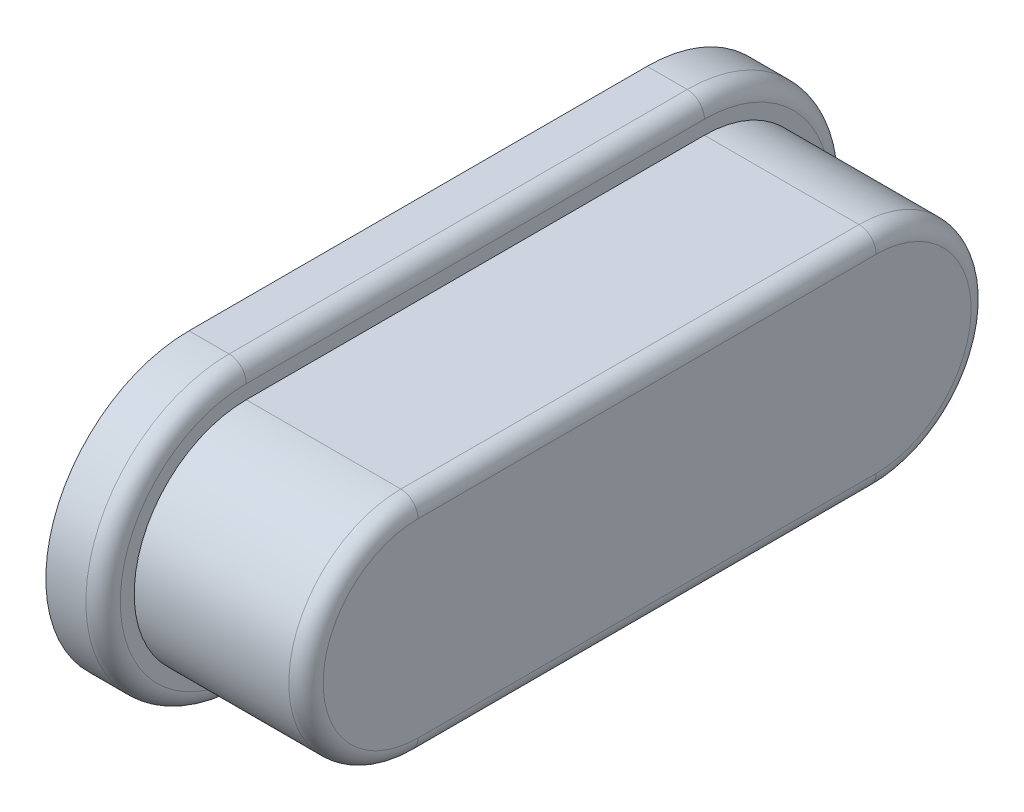
ISO-10303-21;
HEADER;
FILE_DESCRIPTION(('STEP AP214'),'2;1');
FILE_NAME('part.step','',(''),(''),'','','');
FILE_SCHEMA(('AUTOMOTIVE_DESIGN { 1 0 10303 214 1 1 1 1 }'));
ENDSEC;
DATA;
#1=APPLICATION_CONTEXT('core data for automotive mechanical design processes');
#2=APPLICATION_PROTOCOL_DEFINITION('international standard','automotive_design',2000,#1);
#3=PRODUCT_CONTEXT('',#1,'mechanical');
#4=PRODUCT('Part','Part','',(#3));
#5=PRODUCT_RELATED_PRODUCT_CATEGORY('part','',(#4));
#6=PRODUCT_DEFINITION_FORMATION('','',#4);
#7=PRODUCT_DEFINITION_CONTEXT('part definition',#1,'design');
#8=PRODUCT_DEFINITION('design','',#6,#7);
#9=PRODUCT_DEFINITION_SHAPE('','',#8);
#10=(LENGTH_UNIT() NAMED_UNIT(*) SI_UNIT(.MILLI.,.METRE.));
#11=(NAMED_UNIT(*) PLANE_ANGLE_UNIT() SI_UNIT($,.RADIAN.));
#12=(NAMED_UNIT(*) SI_UNIT($,.STERADIAN.) SOLID_ANGLE_UNIT());
#13=UNCERTAINTY_MEASURE_WITH_UNIT(LENGTH_MEASURE(1.E-05),#10,'distance_accuracy_value','');
#14=(GEOMETRIC_REPRESENTATION_CONTEXT(3) GLOBAL_UNCERTAINTY_ASSIGNED_CONTEXT((#13)) GLOBAL_UNIT_ASSIGNED_CONTEXT((#10,
#11,#12)) REPRESENTATION_CONTEXT('',''));
#15=CARTESIAN_POINT('',(0.,0.,0.));
#16=DIRECTION('',(0.,0.,1.));
#17=DIRECTION('',(1.,0.,0.));
#18=AXIS2_PLACEMENT_3D('',#15,#16,#17);
#19=CARTESIAN_POINT('',(1.,0.,0.));
#20=DIRECTION('',(1.,0.,0.));
#21=DIRECTION('',(0.,0.,-1.));
#22=AXIS2_PLACEMENT_3D('',#19,#20,#21);
#23=PLANE('',#22);
#24=CARTESIAN_POINT('',(1.,0.,-8.));
#25=DIRECTION('',(1.,0.,0.));
#26=DIRECTION('',(0.,0.,-1.));
#27=AXIS2_PLACEMENT_3D('',#24,#25,#26);
#28=CIRCLE('',#27,2.2);
#29=CARTESIAN_POINT('',(1.,-2.2,-8.));
#30=VERTEX_POINT('',#29);
#31=CARTESIAN_POINT('',(1.,2.2,-8.));
#32=VERTEX_POINT('',#31);
#33=EDGE_CURVE('E181',#30,#32,#28,.T.);
#34=ORIENTED_EDGE('',*,*,#33,.T.);
#35=DIRECTION('',(0.,0.,1.));
#36=VECTOR('',#35,1.);
#37=CARTESIAN_POINT('',(1.,2.2,0.));
#38=LINE('',#37,#36);
#39=CARTESIAN_POINT('',(1.,2.2,0.));
#40=VERTEX_POINT('',#39);
#41=EDGE_CURVE('E183',#32,#40,#38,.T.);
#42=ORIENTED_EDGE('',*,*,#41,.T.);
#43=CARTESIAN_POINT('',(1.,0.,0.));
#44=DIRECTION('',(1.,0.,0.));
#45=DIRECTION('',(0.,0.,-1.));
#46=AXIS2_PLACEMENT_3D('',#43,#44,#45);
#47=CIRCLE('',#46,2.2);
#48=CARTESIAN_POINT('',(1.,-2.2,0.));
#49=VERTEX_POINT('',#48);
#50=EDGE_CURVE('E179',#40,#49,#47,.T.);
#51=ORIENTED_EDGE('',*,*,#50,.T.);
#52=DIRECTION('',(0.,0.,-1.));
#53=VECTOR('',#52,1.);
#54=CARTESIAN_POINT('',(1.,-2.2,-8.));
#55=LINE('',#54,#53);
#56=EDGE_CURVE('E177',#49,#30,#55,.T.);
#57=ORIENTED_EDGE('',*,*,#56,.T.);
#58=EDGE_LOOP('',(#34,#42,#51,#57));
#59=FACE_BOUND('',#58,.T.);
#60=DIRECTION('',(0.,0.,-1.));
#61=VECTOR('',#60,1.);
#62=CARTESIAN_POINT('',(1.,-1.95713580910831,0.));
#63=LINE('',#62,#61);
#64=CARTESIAN_POINT('',(1.,-1.95713580910831,0.));
#65=VERTEX_POINT('',#64);
#66=CARTESIAN_POINT('',(1.,-1.95713580910831,-8.));
#67=VERTEX_POINT('',#66);
#68=EDGE_CURVE('E129',#65,#67,#63,.T.);
#69=ORIENTED_EDGE('',*,*,#68,.F.);
#70=CARTESIAN_POINT('',(1.,0.,0.));
#71=DIRECTION('',(1.,0.,0.));
#72=DIRECTION('',(0.,0.,-1.));
#73=AXIS2_PLACEMENT_3D('',#70,#71,#72);
#74=CIRCLE('',#73,1.95713580910831);
#75=CARTESIAN_POINT('',(1.,1.95713580910831,0.));
#76=VERTEX_POINT('',#75);
#77=EDGE_CURVE('E139',#76,#65,#74,.T.);
#78=ORIENTED_EDGE('',*,*,#77,.F.);
#79=DIRECTION('',(0.,0.,1.));
#80=VECTOR('',#79,1.);
#81=CARTESIAN_POINT('',(1.,1.95713580910831,0.));
#82=LINE('',#81,#80);
#83=CARTESIAN_POINT('',(1.,1.95713580910831,-8.));
#84=VERTEX_POINT('',#83);
#85=EDGE_CURVE('E150',#84,#76,#82,.T.);
#86=ORIENTED_EDGE('',*,*,#85,.F.);
#87=CARTESIAN_POINT('',(1.,0.,-8.));
#88=DIRECTION('',(1.,0.,0.));
#89=DIRECTION('',(0.,0.,-1.));
#90=AXIS2_PLACEMENT_3D('',#87,#88,#89);
#91=CIRCLE('',#90,1.95713580910831);
#92=EDGE_CURVE('E148',#67,#84,#91,.T.);
#93=ORIENTED_EDGE('',*,*,#92,.F.);
#94=EDGE_LOOP('',(#69,#78,#86,#93));
#95=FACE_BOUND('',#94,.T.);
#96=ADVANCED_FACE('F35',(#59,#95),#23,.T.);
#97=CARTESIAN_POINT('',(1.,0.,0.));
#98=DIRECTION('',(-1.,0.,0.));
#99=DIRECTION('',(0.,0.,1.));
#100=AXIS2_PLACEMENT_3D('',#97,#98,#99);
#101=CYLINDRICAL_SURFACE('',#100,2.5);
#102=DIRECTION('',(-1.,0.,0.));
#103=VECTOR('',#102,1.);
#104=CARTESIAN_POINT('',(1.,-2.5,0.));
#105=LINE('',#104,#103);
#106=CARTESIAN_POINT('',(0.7,-2.5,0.));
#107=VERTEX_POINT('',#106);
#108=CARTESIAN_POINT('',(0.,-2.5,0.));
#109=VERTEX_POINT('',#108);
#110=EDGE_CURVE('E175',#107,#109,#105,.T.);
#111=ORIENTED_EDGE('',*,*,#110,.F.);
#112=CARTESIAN_POINT('',(0.7,0.,0.));
#113=DIRECTION('',(1.,0.,0.));
#114=DIRECTION('',(0.,0.,-1.));
#115=AXIS2_PLACEMENT_3D('',#112,#113,#114);
#116=CIRCLE('',#115,2.5);
#117=CARTESIAN_POINT('',(0.7,2.5,0.));
#118=VERTEX_POINT('',#117);
#119=EDGE_CURVE('E191',#107,#118,#116,.F.);
#120=ORIENTED_EDGE('',*,*,#119,.T.);
#121=DIRECTION('',(-1.,0.,0.));
#122=VECTOR('',#121,1.);
#123=CARTESIAN_POINT('',(1.,2.5,0.));
#124=LINE('',#123,#122);
#125=CARTESIAN_POINT('',(0.,2.5,0.));
#126=VERTEX_POINT('',#125);
#127=EDGE_CURVE('E169',#118,#126,#124,.T.);
#128=ORIENTED_EDGE('',*,*,#127,.T.);
#129=CARTESIAN_POINT('',(0.,0.,0.));
#130=DIRECTION('',(1.,0.,0.));
#131=DIRECTION('',(0.,0.,-1.));
#132=AXIS2_PLACEMENT_3D('',#129,#130,#131);
#133=CIRCLE('',#132,2.5);
#134=EDGE_CURVE('E135',#126,#109,#133,.T.);
#135=ORIENTED_EDGE('',*,*,#134,.T.);
#136=EDGE_LOOP('',(#111,#120,#128,#135));
#137=FACE_BOUND('',#136,.T.);
#138=ADVANCED_FACE('F250',(#137),#101,.T.);
#139=CARTESIAN_POINT('',(1.,-2.5,0.));
#140=DIRECTION('',(0.,1.,0.));
#141=DIRECTION('',(0.,0.,1.));
#142=AXIS2_PLACEMENT_3D('',#139,#140,#141);
#143=PLANE('',#142);
#144=DIRECTION('',(-1.,0.,0.));
#145=VECTOR('',#144,1.);
#146=CARTESIAN_POINT('',(1.,-2.5,-8.));
#147=LINE('',#146,#145);
#148=CARTESIAN_POINT('',(0.7,-2.5,-8.));
#149=VERTEX_POINT('',#148);
#150=CARTESIAN_POINT('',(0.,-2.5,-8.));
#151=VERTEX_POINT('',#150);
#152=EDGE_CURVE('E173',#149,#151,#147,.T.);
#153=ORIENTED_EDGE('',*,*,#152,.F.);
#154=DIRECTION('',(0.,0.,-1.));
#155=VECTOR('',#154,1.);
#156=CARTESIAN_POINT('',(0.7,-2.5,0.));
#157=LINE('',#156,#155);
#158=EDGE_CURVE('E193',#149,#107,#157,.F.);
#159=ORIENTED_EDGE('',*,*,#158,.T.);
#160=ORIENTED_EDGE('',*,*,#110,.T.);
#161=DIRECTION('',(0.,0.,-1.));
#162=VECTOR('',#161,1.);
#163=CARTESIAN_POINT('',(0.,-2.5,0.));
#164=LINE('',#163,#162);
#165=EDGE_CURVE('E160',#109,#151,#164,.T.);
#166=ORIENTED_EDGE('',*,*,#165,.T.);
#167=EDGE_LOOP('',(#153,#159,#160,#166));
#168=FACE_BOUND('',#167,.T.);
#169=ADVANCED_FACE('F256',(#168),#143,.F.);
#170=CARTESIAN_POINT('',(1.,0.,-8.));
#171=DIRECTION('',(-1.,0.,0.));
#172=DIRECTION('',(0.,0.,1.));
#173=AXIS2_PLACEMENT_3D('',#170,#171,#172);
#174=CYLINDRICAL_SURFACE('',#173,2.5);
#175=DIRECTION('',(-1.,0.,0.));
#176=VECTOR('',#175,1.);
#177=CARTESIAN_POINT('',(1.,2.5,-8.));
#178=LINE('',#177,#176);
#179=CARTESIAN_POINT('',(0.7,2.5,-8.));
#180=VERTEX_POINT('',#179);
#181=CARTESIAN_POINT('',(0.,2.5,-8.));
#182=VERTEX_POINT('',#181);
#183=EDGE_CURVE('E171',#180,#182,#178,.T.);
#184=ORIENTED_EDGE('',*,*,#183,.F.);
#185=CARTESIAN_POINT('',(0.7,0.,-8.));
#186=DIRECTION('',(1.,0.,0.));
#187=DIRECTION('',(0.,0.,-1.));
#188=AXIS2_PLACEMENT_3D('',#185,#186,#187);
#189=CIRCLE('',#188,2.5);
#190=EDGE_CURVE('E189',#180,#149,#189,.F.);
#191=ORIENTED_EDGE('',*,*,#190,.T.);
#192=ORIENTED_EDGE('',*,*,#152,.T.);
#193=CARTESIAN_POINT('',(0.,0.,-8.));
#194=DIRECTION('',(1.,0.,0.));
#195=DIRECTION('',(0.,0.,-1.));
#196=AXIS2_PLACEMENT_3D('',#193,#194,#195);
#197=CIRCLE('',#196,2.5);
#198=EDGE_CURVE('E163',#151,#182,#197,.T.);
#199=ORIENTED_EDGE('',*,*,#198,.T.);
#200=EDGE_LOOP('',(#184,#191,#192,#199));
#201=FACE_BOUND('',#200,.T.);
#202=ADVANCED_FACE('F268',(#201),#174,.T.);
#203=CARTESIAN_POINT('',(1.,2.5,0.));
#204=DIRECTION('',(0.,-1.,0.));
#205=DIRECTION('',(0.,0.,-1.));
#206=AXIS2_PLACEMENT_3D('',#203,#204,#205);
#207=PLANE('',#206);
#208=ORIENTED_EDGE('',*,*,#127,.F.);
#209=DIRECTION('',(0.,0.,1.));
#210=VECTOR('',#209,1.);
#211=CARTESIAN_POINT('',(0.7,2.5,-8.));
#212=LINE('',#211,#210);
#213=EDGE_CURVE('E186',#118,#180,#212,.F.);
#214=ORIENTED_EDGE('',*,*,#213,.T.);
#215=ORIENTED_EDGE('',*,*,#183,.T.);
#216=DIRECTION('',(0.,0.,1.));
#217=VECTOR('',#216,1.);
#218=CARTESIAN_POINT('',(0.,2.5,0.));
#219=LINE('',#218,#217);
#220=EDGE_CURVE('E166',#182,#126,#219,.T.);
#221=ORIENTED_EDGE('',*,*,#220,.T.);
#222=EDGE_LOOP('',(#208,#214,#215,#221));
#223=FACE_BOUND('',#222,.T.);
#224=ADVANCED_FACE('F264',(#223),#207,.F.);
#225=CARTESIAN_POINT('',(0.,0.,0.));
#226=DIRECTION('',(1.,0.,0.));
#227=DIRECTION('',(0.,0.,-1.));
#228=AXIS2_PLACEMENT_3D('',#225,#226,#227);
#229=PLANE('',#228);
#230=ORIENTED_EDGE('',*,*,#134,.F.);
#231=ORIENTED_EDGE('',*,*,#220,.F.);
#232=ORIENTED_EDGE('',*,*,#198,.F.);
#233=ORIENTED_EDGE('',*,*,#165,.F.);
#234=EDGE_LOOP('',(#230,#231,#232,#233));
#235=FACE_BOUND('',#234,.T.);
#236=ADVANCED_FACE('F261',(#235),#229,.F.);
#237=CARTESIAN_POINT('',(4.,0.,0.));
#238=DIRECTION('',(-1.,0.,0.));
#239=DIRECTION('',(0.,0.,1.));
#240=AXIS2_PLACEMENT_3D('',#237,#238,#239);
#241=CYLINDRICAL_SURFACE('',#240,1.95713580910831);
#242=DIRECTION('',(-1.,0.,0.));
#243=VECTOR('',#242,1.);
#244=CARTESIAN_POINT('',(4.,-1.95713580910831,0.));
#245=LINE('',#244,#243);
#246=CARTESIAN_POINT('',(3.7,-1.95713580910831,0.));
#247=VERTEX_POINT('',#246);
#248=EDGE_CURVE('E125',#247,#65,#245,.T.);
#249=ORIENTED_EDGE('',*,*,#248,.F.);
#250=CARTESIAN_POINT('',(3.7,0.,0.));
#251=DIRECTION('',(1.,0.,0.));
#252=DIRECTION('',(0.,0.,-1.));
#253=AXIS2_PLACEMENT_3D('',#250,#251,#252);
#254=CIRCLE('',#253,1.95713580910831);
#255=CARTESIAN_POINT('',(3.7,1.95713580910831,0.));
#256=VERTEX_POINT('',#255);
#257=EDGE_CURVE('E204',#247,#256,#254,.F.);
#258=ORIENTED_EDGE('',*,*,#257,.T.);
#259=DIRECTION('',(-1.,0.,0.));
#260=VECTOR('',#259,1.);
#261=CARTESIAN_POINT('',(4.,1.95713580910831,0.));
#262=LINE('',#261,#260);
#263=EDGE_CURVE('E141',#256,#76,#262,.T.);
#264=ORIENTED_EDGE('',*,*,#263,.T.);
#265=ORIENTED_EDGE('',*,*,#77,.T.);
#266=EDGE_LOOP('',(#249,#258,#264,#265));
#267=FACE_BOUND('',#266,.T.);
#268=ADVANCED_FACE('F140',(#267),#241,.T.);
#269=CARTESIAN_POINT('',(4.,-1.95713580910831,0.));
#270=DIRECTION('',(0.,1.,0.));
#271=DIRECTION('',(0.,0.,1.));
#272=AXIS2_PLACEMENT_3D('',#269,#270,#271);
#273=PLANE('',#272);
#274=DIRECTION('',(-1.,0.,0.));
#275=VECTOR('',#274,1.);
#276=CARTESIAN_POINT('',(4.,-1.95713580910831,-8.));
#277=LINE('',#276,#275);
#278=CARTESIAN_POINT('',(3.7,-1.95713580910831,-8.));
#279=VERTEX_POINT('',#278);
#280=EDGE_CURVE('E136',#279,#67,#277,.T.);
#281=ORIENTED_EDGE('',*,*,#280,.F.);
#282=DIRECTION('',(0.,0.,-1.));
#283=VECTOR('',#282,1.);
#284=CARTESIAN_POINT('',(3.7,-1.95713580910831,0.));
#285=LINE('',#284,#283);
#286=EDGE_CURVE('E11',#279,#247,#285,.F.);
#287=ORIENTED_EDGE('',*,*,#286,.T.);
#288=ORIENTED_EDGE('',*,*,#248,.T.);
#289=ORIENTED_EDGE('',*,*,#68,.T.);
#290=EDGE_LOOP('',(#281,#287,#288,#289));
#291=FACE_BOUND('',#290,.T.);
#292=ADVANCED_FACE('F127',(#291),#273,.F.);
#293=CARTESIAN_POINT('',(4.,0.,-8.));
#294=DIRECTION('',(-1.,0.,0.));
#295=DIRECTION('',(0.,0.,1.));
#296=AXIS2_PLACEMENT_3D('',#293,#294,#295);
#297=CYLINDRICAL_SURFACE('',#296,1.95713580910831);
#298=DIRECTION('',(-1.,0.,0.));
#299=VECTOR('',#298,1.);
#300=CARTESIAN_POINT('',(4.,1.95713580910831,-8.));
#301=LINE('',#300,#299);
#302=CARTESIAN_POINT('',(3.7,1.95713580910831,-8.));
#303=VERTEX_POINT('',#302);
#304=EDGE_CURVE('E155',#303,#84,#301,.T.);
#305=ORIENTED_EDGE('',*,*,#304,.F.);
#306=CARTESIAN_POINT('',(3.7,0.,-8.));
#307=DIRECTION('',(1.,0.,0.));
#308=DIRECTION('',(0.,0.,-1.));
#309=AXIS2_PLACEMENT_3D('',#306,#307,#308);
#310=CIRCLE('',#309,1.95713580910831);
#311=EDGE_CURVE('E44',#303,#279,#310,.F.);
#312=ORIENTED_EDGE('',*,*,#311,.T.);
#313=ORIENTED_EDGE('',*,*,#280,.T.);
#314=ORIENTED_EDGE('',*,*,#92,.T.);
#315=EDGE_LOOP('',(#305,#312,#313,#314));
#316=FACE_BOUND('',#315,.T.);
#317=ADVANCED_FACE('F239',(#316),#297,.T.);
#318=CARTESIAN_POINT('',(4.,1.95713580910831,0.));
#319=DIRECTION('',(0.,-1.,0.));
#320=DIRECTION('',(0.,0.,-1.));
#321=AXIS2_PLACEMENT_3D('',#318,#319,#320);
#322=PLANE('',#321);
#323=ORIENTED_EDGE('',*,*,#263,.F.);
#324=DIRECTION('',(0.,0.,1.));
#325=VECTOR('',#324,1.);
#326=CARTESIAN_POINT('',(3.7,1.95713580910831,-8.));
#327=LINE('',#326,#325);
#328=EDGE_CURVE('E59',#256,#303,#327,.F.);
#329=ORIENTED_EDGE('',*,*,#328,.T.);
#330=ORIENTED_EDGE('',*,*,#304,.T.);
#331=ORIENTED_EDGE('',*,*,#85,.T.);
#332=EDGE_LOOP('',(#323,#329,#330,#331));
#333=FACE_BOUND('',#332,.T.);
#334=ADVANCED_FACE('F238',(#333),#322,.F.);
#335=CARTESIAN_POINT('',(4.,0.,0.));
#336=DIRECTION('',(1.,0.,0.));
#337=DIRECTION('',(0.,0.,-1.));
#338=AXIS2_PLACEMENT_3D('',#335,#336,#337);
#339=PLANE('',#338);
#340=DIRECTION('',(0.,0.,1.));
#341=VECTOR('',#340,1.);
#342=CARTESIAN_POINT('',(4.,1.65713580910831,0.));
#343=LINE('',#342,#341);
#344=CARTESIAN_POINT('',(4.,1.65713580910831,-8.));
#345=VERTEX_POINT('',#344);
#346=CARTESIAN_POINT('',(4.,1.65713580910831,0.));
#347=VERTEX_POINT('',#346);
#348=EDGE_CURVE('E199',#345,#347,#343,.T.);
#349=ORIENTED_EDGE('',*,*,#348,.T.);
#350=CARTESIAN_POINT('',(4.,0.,0.));
#351=DIRECTION('',(1.,0.,0.));
#352=DIRECTION('',(0.,0.,-1.));
#353=AXIS2_PLACEMENT_3D('',#350,#351,#352);
#354=CIRCLE('',#353,1.65713580910831);
#355=CARTESIAN_POINT('',(4.,-1.65713580910831,0.));
#356=VERTEX_POINT('',#355);
#357=EDGE_CURVE('E201',#347,#356,#354,.T.);
#358=ORIENTED_EDGE('',*,*,#357,.T.);
#359=DIRECTION('',(0.,0.,-1.));
#360=VECTOR('',#359,1.);
#361=CARTESIAN_POINT('',(4.,-1.65713580910831,-8.));
#362=LINE('',#361,#360);
#363=CARTESIAN_POINT('',(4.,-1.65713580910831,-8.));
#364=VERTEX_POINT('',#363);
#365=EDGE_CURVE('E195',#356,#364,#362,.T.);
#366=ORIENTED_EDGE('',*,*,#365,.T.);
#367=CARTESIAN_POINT('',(4.,0.,-8.));
#368=DIRECTION('',(1.,0.,0.));
#369=DIRECTION('',(0.,0.,-1.));
#370=AXIS2_PLACEMENT_3D('',#367,#368,#369);
#371=CIRCLE('',#370,1.65713580910831);
#372=EDGE_CURVE('E197',#364,#345,#371,.T.);
#373=ORIENTED_EDGE('',*,*,#372,.T.);
#374=EDGE_LOOP('',(#349,#358,#366,#373));
#375=FACE_BOUND('',#374,.T.);
#376=ADVANCED_FACE('F246',(#375),#339,.T.);
#377=CARTESIAN_POINT('',(0.7,-2.2,0.));
#378=DIRECTION('',(0.,0.,1.));
#379=DIRECTION('',(1.,0.,0.));
#380=AXIS2_PLACEMENT_3D('',#377,#378,#379);
#381=CYLINDRICAL_SURFACE('',#380,0.3);
#382=CARTESIAN_POINT('',(0.7,-2.2,0.));
#383=DIRECTION('',(0.,0.,1.));
#384=DIRECTION('',(1.,0.,0.));
#385=AXIS2_PLACEMENT_3D('',#382,#383,#384);
#386=CIRCLE('',#385,0.3);
#387=EDGE_CURVE('E212',#107,#49,#386,.T.);
#388=ORIENTED_EDGE('',*,*,#387,.F.);
#389=ORIENTED_EDGE('',*,*,#158,.F.);
#390=CARTESIAN_POINT('',(0.7,-2.2,-8.));
#391=DIRECTION('',(0.,0.,-1.));
#392=DIRECTION('',(-1.,0.,0.));
#393=AXIS2_PLACEMENT_3D('',#390,#391,#392);
#394=CIRCLE('',#393,0.3);
#395=EDGE_CURVE('E145',#30,#149,#394,.T.);
#396=ORIENTED_EDGE('',*,*,#395,.F.);
#397=ORIENTED_EDGE('',*,*,#56,.F.);
#398=EDGE_LOOP('',(#388,#389,#396,#397));
#399=FACE_BOUND('',#398,.T.);
#400=ADVANCED_FACE('F287',(#399),#381,.T.);
#401=CARTESIAN_POINT('',(0.7,0.,-8.));
#402=DIRECTION('',(1.,0.,0.));
#403=DIRECTION('',(0.,0.,-1.));
#404=AXIS2_PLACEMENT_3D('',#401,#402,#403);
#405=TOROIDAL_SURFACE('',#404,2.2,0.3);
#406=ORIENTED_EDGE('',*,*,#395,.T.);
#407=ORIENTED_EDGE('',*,*,#190,.F.);
#408=CARTESIAN_POINT('',(0.7,2.2,-8.));
#409=DIRECTION('',(0.,0.,1.));
#410=DIRECTION('',(1.,0.,0.));
#411=AXIS2_PLACEMENT_3D('',#408,#409,#410);
#412=CIRCLE('',#411,0.3);
#413=EDGE_CURVE('E210',#32,#180,#412,.T.);
#414=ORIENTED_EDGE('',*,*,#413,.F.);
#415=ORIENTED_EDGE('',*,*,#33,.F.);
#416=EDGE_LOOP('',(#406,#407,#414,#415));
#417=FACE_BOUND('',#416,.T.);
#418=ADVANCED_FACE('F283',(#417),#405,.T.);
#419=CARTESIAN_POINT('',(0.7,0.,0.));
#420=DIRECTION('',(1.,0.,0.));
#421=DIRECTION('',(0.,0.,-1.));
#422=AXIS2_PLACEMENT_3D('',#419,#420,#421);
#423=TOROIDAL_SURFACE('',#422,2.2,0.3);
#424=ORIENTED_EDGE('',*,*,#387,.T.);
#425=ORIENTED_EDGE('',*,*,#50,.F.);
#426=CARTESIAN_POINT('',(0.7,2.2,0.));
#427=DIRECTION('',(0.,0.,-1.));
#428=DIRECTION('',(-1.,0.,0.));
#429=AXIS2_PLACEMENT_3D('',#426,#427,#428);
#430=CIRCLE('',#429,0.3);
#431=EDGE_CURVE('E208',#118,#40,#430,.T.);
#432=ORIENTED_EDGE('',*,*,#431,.F.);
#433=ORIENTED_EDGE('',*,*,#119,.F.);
#434=EDGE_LOOP('',(#424,#425,#432,#433));
#435=FACE_BOUND('',#434,.T.);
#436=ADVANCED_FACE('F279',(#435),#423,.T.);
#437=CARTESIAN_POINT('',(0.7,2.2,0.));
#438=DIRECTION('',(0.,0.,-1.));
#439=DIRECTION('',(-1.,0.,0.));
#440=AXIS2_PLACEMENT_3D('',#437,#438,#439);
#441=CYLINDRICAL_SURFACE('',#440,0.3);
#442=ORIENTED_EDGE('',*,*,#413,.T.);
#443=ORIENTED_EDGE('',*,*,#213,.F.);
#444=ORIENTED_EDGE('',*,*,#431,.T.);
#445=ORIENTED_EDGE('',*,*,#41,.F.);
#446=EDGE_LOOP('',(#442,#443,#444,#445));
#447=FACE_BOUND('',#446,.T.);
#448=ADVANCED_FACE('F276',(#447),#441,.T.);
#449=CARTESIAN_POINT('',(3.7,0.,-8.));
#450=DIRECTION('',(1.,0.,0.));
#451=DIRECTION('',(0.,0.,-1.));
#452=AXIS2_PLACEMENT_3D('',#449,#450,#451);
#453=TOROIDAL_SURFACE('',#452,1.65713580910831,0.3);
#454=CARTESIAN_POINT('',(3.7,-1.65713580910831,-8.));
#455=DIRECTION('',(0.,0.,1.));
#456=DIRECTION('',(1.,0.,0.));
#457=AXIS2_PLACEMENT_3D('',#454,#455,#456);
#458=CIRCLE('',#457,0.3);
#459=EDGE_CURVE('E220',#279,#364,#458,.T.);
#460=ORIENTED_EDGE('',*,*,#459,.F.);
#461=ORIENTED_EDGE('',*,*,#311,.F.);
#462=CARTESIAN_POINT('',(3.7,1.65713580910831,-8.));
#463=DIRECTION('',(0.,0.,1.));
#464=DIRECTION('',(1.,0.,0.));
#465=AXIS2_PLACEMENT_3D('',#462,#463,#464);
#466=CIRCLE('',#465,0.3);
#467=EDGE_CURVE('E39',#345,#303,#466,.T.);
#468=ORIENTED_EDGE('',*,*,#467,.F.);
#469=ORIENTED_EDGE('',*,*,#372,.F.);
#470=EDGE_LOOP('',(#460,#461,#468,#469));
#471=FACE_BOUND('',#470,.T.);
#472=ADVANCED_FACE('F37',(#471),#453,.T.);
#473=CARTESIAN_POINT('',(3.7,1.65713580910831,0.));
#474=DIRECTION('',(0.,0.,-1.));
#475=DIRECTION('',(-1.,0.,0.));
#476=AXIS2_PLACEMENT_3D('',#473,#474,#475);
#477=CYLINDRICAL_SURFACE('',#476,0.3);
#478=ORIENTED_EDGE('',*,*,#467,.T.);
#479=ORIENTED_EDGE('',*,*,#328,.F.);
#480=CARTESIAN_POINT('',(3.7,1.65713580910831,0.));
#481=DIRECTION('',(0.,0.,1.));
#482=DIRECTION('',(1.,0.,0.));
#483=AXIS2_PLACEMENT_3D('',#480,#481,#482);
#484=CIRCLE('',#483,0.3);
#485=EDGE_CURVE('E219',#347,#256,#484,.T.);
#486=ORIENTED_EDGE('',*,*,#485,.F.);
#487=ORIENTED_EDGE('',*,*,#348,.F.);
#488=EDGE_LOOP('',(#478,#479,#486,#487));
#489=FACE_BOUND('',#488,.T.);
#490=ADVANCED_FACE('F229',(#489),#477,.T.);
#491=CARTESIAN_POINT('',(3.7,-1.65713580910831,0.));
#492=DIRECTION('',(0.,0.,1.));
#493=DIRECTION('',(1.,0.,0.));
#494=AXIS2_PLACEMENT_3D('',#491,#492,#493);
#495=CYLINDRICAL_SURFACE('',#494,0.3);
#496=ORIENTED_EDGE('',*,*,#459,.T.);
#497=ORIENTED_EDGE('',*,*,#365,.F.);
#498=CARTESIAN_POINT('',(3.7,-1.65713580910831,0.));
#499=DIRECTION('',(0.,0.,1.));
#500=DIRECTION('',(1.,0.,0.));
#501=AXIS2_PLACEMENT_3D('',#498,#499,#500);
#502=CIRCLE('',#501,0.3);
#503=EDGE_CURVE('E217',#247,#356,#502,.T.);
#504=ORIENTED_EDGE('',*,*,#503,.F.);
#505=ORIENTED_EDGE('',*,*,#286,.F.);
#506=EDGE_LOOP('',(#496,#497,#504,#505));
#507=FACE_BOUND('',#506,.T.);
#508=ADVANCED_FACE('F234',(#507),#495,.T.);
#509=CARTESIAN_POINT('',(3.7,0.,0.));
#510=DIRECTION('',(1.,0.,0.));
#511=DIRECTION('',(0.,0.,-1.));
#512=AXIS2_PLACEMENT_3D('',#509,#510,#511);
#513=TOROIDAL_SURFACE('',#512,1.65713580910831,0.3);
#514=ORIENTED_EDGE('',*,*,#485,.T.);
#515=ORIENTED_EDGE('',*,*,#257,.F.);
#516=ORIENTED_EDGE('',*,*,#503,.T.);
#517=ORIENTED_EDGE('',*,*,#357,.F.);
#518=EDGE_LOOP('',(#514,#515,#516,#517));
#519=FACE_BOUND('',#518,.T.);
#520=ADVANCED_FACE('F237',(#519),#513,.T.);
#521=CLOSED_SHELL('',(#96,#138,#169,#202,#224,#236,#268,#292,#317,#334,#376,#400,#418,#436,#448,
#472,#490,#508,#520));
#522=MANIFOLD_SOLID_BREP('B2',#521);
#523=ADVANCED_BREP_SHAPE_REPRESENTATION('',(#18,#522),#14);
#524=SHAPE_DEFINITION_REPRESENTATION(#9,#523);
ENDSEC;
END-ISO-10303-21;
